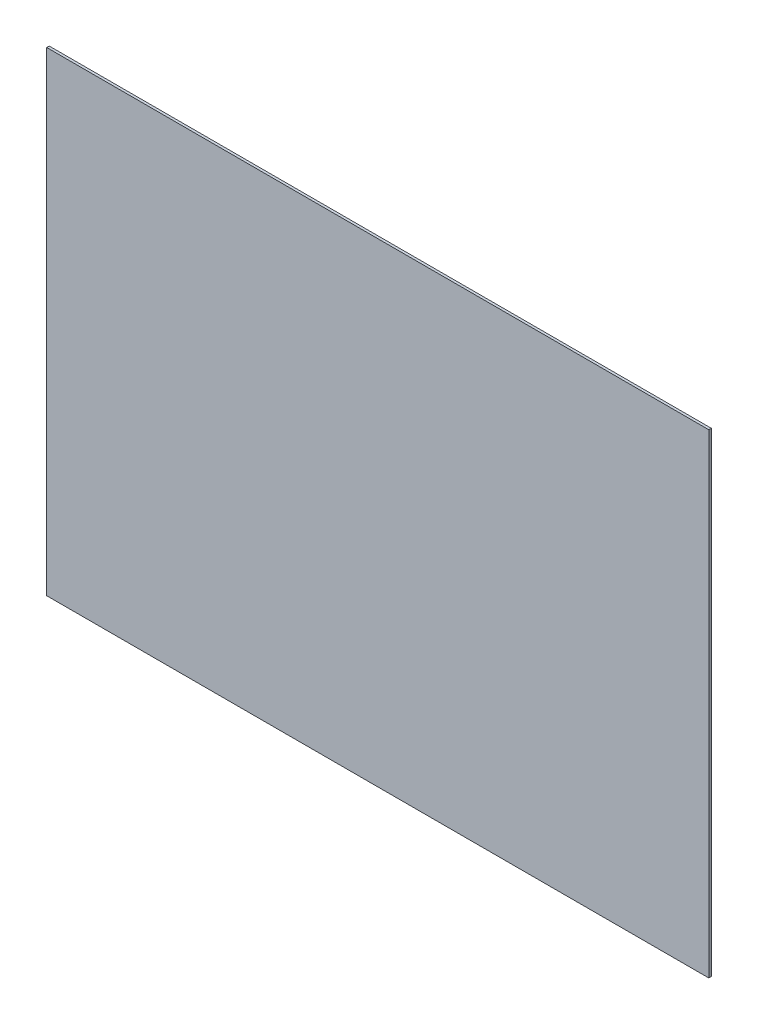
ISO-10303-21;
HEADER;
FILE_DESCRIPTION(('STEP AP214'),'2;1');
FILE_NAME('part.step','',(''),(''),'','','');
FILE_SCHEMA(('AUTOMOTIVE_DESIGN { 1 0 10303 214 1 1 1 1 }'));
ENDSEC;
DATA;
#1=APPLICATION_CONTEXT('core data for automotive mechanical design processes');
#2=APPLICATION_PROTOCOL_DEFINITION('international standard','automotive_design',2000,#1);
#3=PRODUCT_CONTEXT('',#1,'mechanical');
#4=PRODUCT('Part','Part','',(#3));
#5=PRODUCT_RELATED_PRODUCT_CATEGORY('part','',(#4));
#6=PRODUCT_DEFINITION_FORMATION('','',#4);
#7=PRODUCT_DEFINITION_CONTEXT('part definition',#1,'design');
#8=PRODUCT_DEFINITION('design','',#6,#7);
#9=PRODUCT_DEFINITION_SHAPE('','',#8);
#10=(LENGTH_UNIT() NAMED_UNIT(*) SI_UNIT(.MILLI.,.METRE.));
#11=(NAMED_UNIT(*) PLANE_ANGLE_UNIT() SI_UNIT($,.RADIAN.));
#12=(NAMED_UNIT(*) SI_UNIT($,.STERADIAN.) SOLID_ANGLE_UNIT());
#13=UNCERTAINTY_MEASURE_WITH_UNIT(LENGTH_MEASURE(1.E-05),#10,'distance_accuracy_value','');
#14=(GEOMETRIC_REPRESENTATION_CONTEXT(3) GLOBAL_UNCERTAINTY_ASSIGNED_CONTEXT((#13)) GLOBAL_UNIT_ASSIGNED_CONTEXT((#10,
#11,#12)) REPRESENTATION_CONTEXT('',''));
#15=CARTESIAN_POINT('',(0.,0.,0.));
#16=DIRECTION('',(0.,0.,1.));
#17=DIRECTION('',(1.,0.,0.));
#18=AXIS2_PLACEMENT_3D('',#15,#16,#17);
#19=CARTESIAN_POINT('',(625.715,-448.7125,4.7625));
#20=DIRECTION('',(-1.,0.,0.));
#21=DIRECTION('',(0.,0.,1.));
#22=AXIS2_PLACEMENT_3D('',#19,#20,#21);
#23=PLANE('',#22);
#24=DIRECTION('',(0.,1.,0.));
#25=VECTOR('',#24,1.);
#26=CARTESIAN_POINT('',(625.715,-448.7125,0.));
#27=LINE('',#26,#25);
#28=CARTESIAN_POINT('',(625.715,-448.7125,0.));
#29=VERTEX_POINT('',#28);
#30=CARTESIAN_POINT('',(625.715,448.7125,0.));
#31=VERTEX_POINT('',#30);
#32=EDGE_CURVE('E100',#29,#31,#27,.T.);
#33=ORIENTED_EDGE('',*,*,#32,.T.);
#34=DIRECTION('',(0.,0.,-1.));
#35=VECTOR('',#34,1.);
#36=CARTESIAN_POINT('',(625.715,448.7125,4.7625));
#37=LINE('',#36,#35);
#38=CARTESIAN_POINT('',(625.715,448.7125,4.7625));
#39=VERTEX_POINT('',#38);
#40=EDGE_CURVE('E11',#39,#31,#37,.T.);
#41=ORIENTED_EDGE('',*,*,#40,.F.);
#42=DIRECTION('',(0.,1.,0.));
#43=VECTOR('',#42,1.);
#44=CARTESIAN_POINT('',(625.715,-448.7125,4.7625));
#45=LINE('',#44,#43);
#46=CARTESIAN_POINT('',(625.715,-448.7125,4.7625));
#47=VERTEX_POINT('',#46);
#48=EDGE_CURVE('E88',#47,#39,#45,.T.);
#49=ORIENTED_EDGE('',*,*,#48,.F.);
#50=DIRECTION('',(0.,0.,-1.));
#51=VECTOR('',#50,1.);
#52=CARTESIAN_POINT('',(625.715,-448.7125,4.7625));
#53=LINE('',#52,#51);
#54=EDGE_CURVE('E96',#47,#29,#53,.T.);
#55=ORIENTED_EDGE('',*,*,#54,.T.);
#56=EDGE_LOOP('',(#33,#41,#49,#55));
#57=FACE_BOUND('',#56,.T.);
#58=ADVANCED_FACE('F37',(#57),#23,.F.);
#59=CARTESIAN_POINT('',(-625.715,448.7125,4.7625));
#60=DIRECTION('',(0.,-1.,0.));
#61=DIRECTION('',(0.,0.,-1.));
#62=AXIS2_PLACEMENT_3D('',#59,#60,#61);
#63=PLANE('',#62);
#64=DIRECTION('',(-1.,0.,0.));
#65=VECTOR('',#64,1.);
#66=CARTESIAN_POINT('',(-625.715,448.7125,0.));
#67=LINE('',#66,#65);
#68=CARTESIAN_POINT('',(-625.715,448.7125,0.));
#69=VERTEX_POINT('',#68);
#70=EDGE_CURVE('E92',#31,#69,#67,.T.);
#71=ORIENTED_EDGE('',*,*,#70,.T.);
#72=DIRECTION('',(0.,0.,-1.));
#73=VECTOR('',#72,1.);
#74=CARTESIAN_POINT('',(-625.715,448.7125,4.7625));
#75=LINE('',#74,#73);
#76=CARTESIAN_POINT('',(-625.715,448.7125,4.7625));
#77=VERTEX_POINT('',#76);
#78=EDGE_CURVE('E45',#77,#69,#75,.T.);
#79=ORIENTED_EDGE('',*,*,#78,.F.);
#80=DIRECTION('',(-1.,0.,0.));
#81=VECTOR('',#80,1.);
#82=CARTESIAN_POINT('',(-625.715,448.7125,4.7625));
#83=LINE('',#82,#81);
#84=EDGE_CURVE('E83',#39,#77,#83,.T.);
#85=ORIENTED_EDGE('',*,*,#84,.F.);
#86=ORIENTED_EDGE('',*,*,#40,.T.);
#87=EDGE_LOOP('',(#71,#79,#85,#86));
#88=FACE_BOUND('',#87,.T.);
#89=ADVANCED_FACE('F91',(#88),#63,.F.);
#90=CARTESIAN_POINT('',(-625.715,-448.7125,4.7625));
#91=DIRECTION('',(1.,0.,0.));
#92=DIRECTION('',(0.,0.,-1.));
#93=AXIS2_PLACEMENT_3D('',#90,#91,#92);
#94=PLANE('',#93);
#95=DIRECTION('',(0.,-1.,0.));
#96=VECTOR('',#95,1.);
#97=CARTESIAN_POINT('',(-625.715,-448.7125,0.));
#98=LINE('',#97,#96);
#99=CARTESIAN_POINT('',(-625.715,-448.7125,0.));
#100=VERTEX_POINT('',#99);
#101=EDGE_CURVE('E70',#69,#100,#98,.T.);
#102=ORIENTED_EDGE('',*,*,#101,.T.);
#103=DIRECTION('',(0.,0.,-1.));
#104=VECTOR('',#103,1.);
#105=CARTESIAN_POINT('',(-625.715,-448.7125,4.7625));
#106=LINE('',#105,#104);
#107=CARTESIAN_POINT('',(-625.715,-448.7125,4.7625));
#108=VERTEX_POINT('',#107);
#109=EDGE_CURVE('E93',#108,#100,#106,.T.);
#110=ORIENTED_EDGE('',*,*,#109,.F.);
#111=DIRECTION('',(0.,-1.,0.));
#112=VECTOR('',#111,1.);
#113=CARTESIAN_POINT('',(-625.715,-448.7125,4.7625));
#114=LINE('',#113,#112);
#115=EDGE_CURVE('E86',#77,#108,#114,.T.);
#116=ORIENTED_EDGE('',*,*,#115,.F.);
#117=ORIENTED_EDGE('',*,*,#78,.T.);
#118=EDGE_LOOP('',(#102,#110,#116,#117));
#119=FACE_BOUND('',#118,.T.);
#120=ADVANCED_FACE('F94',(#119),#94,.F.);
#121=CARTESIAN_POINT('',(-625.715,-448.7125,4.7625));
#122=DIRECTION('',(0.,1.,0.));
#123=DIRECTION('',(0.,0.,1.));
#124=AXIS2_PLACEMENT_3D('',#121,#122,#123);
#125=PLANE('',#124);
#126=DIRECTION('',(1.,0.,0.));
#127=VECTOR('',#126,1.);
#128=CARTESIAN_POINT('',(-625.715,-448.7125,0.));
#129=LINE('',#128,#127);
#130=EDGE_CURVE('E76',#100,#29,#129,.T.);
#131=ORIENTED_EDGE('',*,*,#130,.T.);
#132=ORIENTED_EDGE('',*,*,#54,.F.);
#133=DIRECTION('',(1.,0.,0.));
#134=VECTOR('',#133,1.);
#135=CARTESIAN_POINT('',(-625.715,-448.7125,4.7625));
#136=LINE('',#135,#134);
#137=EDGE_CURVE('E53',#108,#47,#136,.T.);
#138=ORIENTED_EDGE('',*,*,#137,.F.);
#139=ORIENTED_EDGE('',*,*,#109,.T.);
#140=EDGE_LOOP('',(#131,#132,#138,#139));
#141=FACE_BOUND('',#140,.T.);
#142=ADVANCED_FACE('F107',(#141),#125,.F.);
#143=CARTESIAN_POINT('',(0.,0.,4.7625));
#144=DIRECTION('',(0.,0.,-1.));
#145=DIRECTION('',(-1.,0.,0.));
#146=AXIS2_PLACEMENT_3D('',#143,#144,#145);
#147=PLANE('',#146);
#148=ORIENTED_EDGE('',*,*,#48,.T.);
#149=ORIENTED_EDGE('',*,*,#84,.T.);
#150=ORIENTED_EDGE('',*,*,#115,.T.);
#151=ORIENTED_EDGE('',*,*,#137,.T.);
#152=EDGE_LOOP('',(#148,#149,#150,#151));
#153=FACE_BOUND('',#152,.T.);
#154=ADVANCED_FACE('F84',(#153),#147,.F.);
#155=CARTESIAN_POINT('',(0.,0.,0.));
#156=DIRECTION('',(0.,0.,-1.));
#157=DIRECTION('',(-1.,0.,0.));
#158=AXIS2_PLACEMENT_3D('',#155,#156,#157);
#159=PLANE('',#158);
#160=ORIENTED_EDGE('',*,*,#32,.F.);
#161=ORIENTED_EDGE('',*,*,#130,.F.);
#162=ORIENTED_EDGE('',*,*,#101,.F.);
#163=ORIENTED_EDGE('',*,*,#70,.F.);
#164=EDGE_LOOP('',(#160,#161,#162,#163));
#165=FACE_BOUND('',#164,.T.);
#166=ADVANCED_FACE('F110',(#165),#159,.T.);
#167=CLOSED_SHELL('',(#58,#89,#120,#142,#154,#166));
#168=MANIFOLD_SOLID_BREP('B2',#167);
#169=ADVANCED_BREP_SHAPE_REPRESENTATION('',(#18,#168),#14);
#170=SHAPE_DEFINITION_REPRESENTATION(#9,#169);
ENDSEC;
END-ISO-10303-21;
